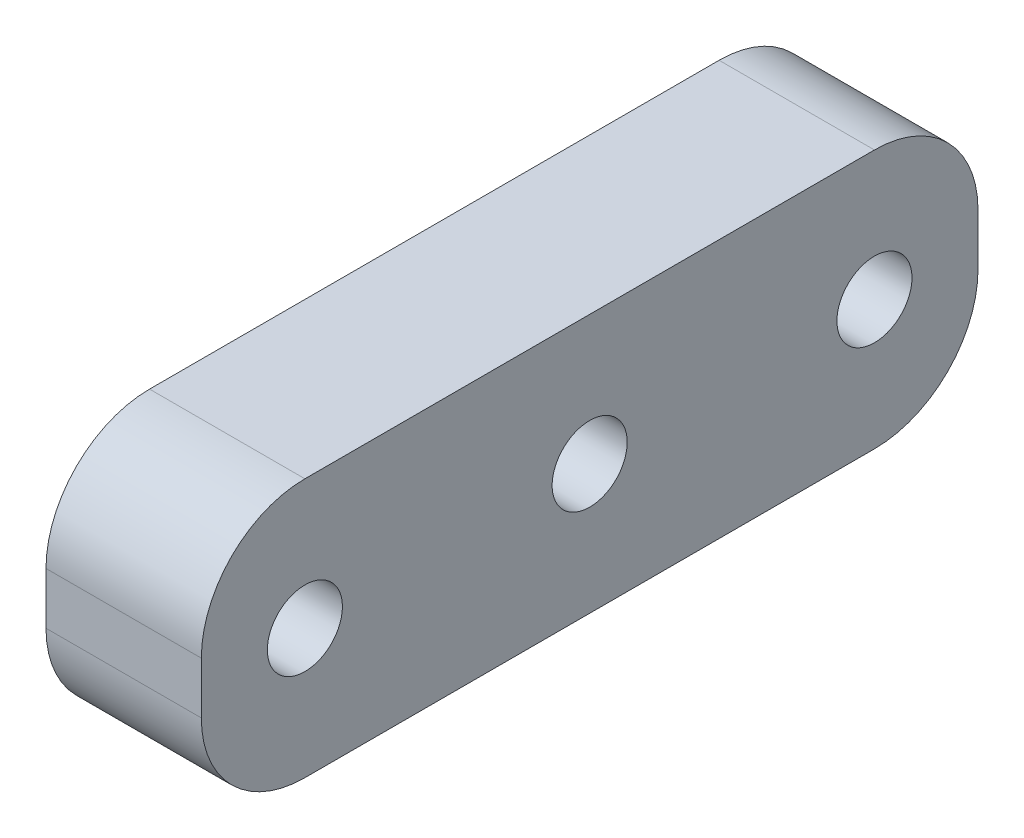
ISO-10303-21;
HEADER;
FILE_DESCRIPTION(('STEP AP214'),'2;1');
FILE_NAME('part.step','',(''),(''),'','','');
FILE_SCHEMA(('AUTOMOTIVE_DESIGN { 1 0 10303 214 1 1 1 1 }'));
ENDSEC;
DATA;
#1=APPLICATION_CONTEXT('core data for automotive mechanical design processes');
#2=APPLICATION_PROTOCOL_DEFINITION('international standard','automotive_design',2000,#1);
#3=PRODUCT_CONTEXT('',#1,'mechanical');
#4=PRODUCT('Part','Part','',(#3));
#5=PRODUCT_RELATED_PRODUCT_CATEGORY('part','',(#4));
#6=PRODUCT_DEFINITION_FORMATION('','',#4);
#7=PRODUCT_DEFINITION_CONTEXT('part definition',#1,'design');
#8=PRODUCT_DEFINITION('design','',#6,#7);
#9=PRODUCT_DEFINITION_SHAPE('','',#8);
#10=(LENGTH_UNIT() NAMED_UNIT(*) SI_UNIT(.MILLI.,.METRE.));
#11=(NAMED_UNIT(*) PLANE_ANGLE_UNIT() SI_UNIT($,.RADIAN.));
#12=(NAMED_UNIT(*) SI_UNIT($,.STERADIAN.) SOLID_ANGLE_UNIT());
#13=UNCERTAINTY_MEASURE_WITH_UNIT(LENGTH_MEASURE(1.E-05),#10,'distance_accuracy_value','');
#14=(GEOMETRIC_REPRESENTATION_CONTEXT(3) GLOBAL_UNCERTAINTY_ASSIGNED_CONTEXT((#13)) GLOBAL_UNIT_ASSIGNED_CONTEXT((#10,
#11,#12)) REPRESENTATION_CONTEXT('',''));
#15=CARTESIAN_POINT('',(0.,0.,0.));
#16=DIRECTION('',(0.,0.,1.));
#17=DIRECTION('',(1.,0.,0.));
#18=AXIS2_PLACEMENT_3D('',#15,#16,#17);
#19=CARTESIAN_POINT('',(6.,0.,0.));
#20=DIRECTION('',(0.,0.,-1.));
#21=DIRECTION('',(-1.,0.,0.));
#22=AXIS2_PLACEMENT_3D('',#19,#20,#21);
#23=PLANE('',#22);
#24=DIRECTION('',(0.,-1.,0.));
#25=VECTOR('',#24,1.);
#26=CARTESIAN_POINT('',(6.,0.,0.));
#27=LINE('',#26,#25);
#28=CARTESIAN_POINT('',(6.,-4.,0.));
#29=VERTEX_POINT('',#28);
#30=CARTESIAN_POINT('',(6.,-6.,0.));
#31=VERTEX_POINT('',#30);
#32=EDGE_CURVE('E128',#29,#31,#27,.T.);
#33=ORIENTED_EDGE('',*,*,#32,.F.);
#34=DIRECTION('',(-1.,0.,0.));
#35=VECTOR('',#34,1.);
#36=CARTESIAN_POINT('',(6.,-4.,0.));
#37=LINE('',#36,#35);
#38=CARTESIAN_POINT('',(0.,-4.,0.));
#39=VERTEX_POINT('',#38);
#40=EDGE_CURVE('E11',#29,#39,#37,.T.);
#41=ORIENTED_EDGE('',*,*,#40,.T.);
#42=DIRECTION('',(0.,-1.,0.));
#43=VECTOR('',#42,1.);
#44=CARTESIAN_POINT('',(0.,0.,0.));
#45=LINE('',#44,#43);
#46=CARTESIAN_POINT('',(0.,-6.,0.));
#47=VERTEX_POINT('',#46);
#48=EDGE_CURVE('E130',#39,#47,#45,.T.);
#49=ORIENTED_EDGE('',*,*,#48,.T.);
#50=DIRECTION('',(-1.,0.,0.));
#51=VECTOR('',#50,1.);
#52=CARTESIAN_POINT('',(6.,-6.,0.));
#53=LINE('',#52,#51);
#54=EDGE_CURVE('E41',#47,#31,#53,.F.);
#55=ORIENTED_EDGE('',*,*,#54,.T.);
#56=EDGE_LOOP('',(#33,#41,#49,#55));
#57=FACE_BOUND('',#56,.T.);
#58=ADVANCED_FACE('F33',(#57),#23,.F.);
#59=CARTESIAN_POINT('',(6.,-10.,0.));
#60=DIRECTION('',(0.,1.,0.));
#61=DIRECTION('',(0.,0.,1.));
#62=AXIS2_PLACEMENT_3D('',#59,#60,#61);
#63=PLANE('',#62);
#64=DIRECTION('',(0.,0.,-1.));
#65=VECTOR('',#64,1.);
#66=CARTESIAN_POINT('',(0.,-10.,0.));
#67=LINE('',#66,#65);
#68=CARTESIAN_POINT('',(0.,-10.,-4.));
#69=VERTEX_POINT('',#68);
#70=CARTESIAN_POINT('',(0.,-10.,-26.));
#71=VERTEX_POINT('',#70);
#72=EDGE_CURVE('E126',#69,#71,#67,.T.);
#73=ORIENTED_EDGE('',*,*,#72,.T.);
#74=DIRECTION('',(-1.,0.,0.));
#75=VECTOR('',#74,1.);
#76=CARTESIAN_POINT('',(6.,-10.,-26.));
#77=LINE('',#76,#75);
#78=CARTESIAN_POINT('',(6.,-10.,-26.));
#79=VERTEX_POINT('',#78);
#80=EDGE_CURVE('E105',#71,#79,#77,.F.);
#81=ORIENTED_EDGE('',*,*,#80,.T.);
#82=DIRECTION('',(0.,0.,-1.));
#83=VECTOR('',#82,1.);
#84=CARTESIAN_POINT('',(6.,-10.,0.));
#85=LINE('',#84,#83);
#86=CARTESIAN_POINT('',(6.,-10.,-4.));
#87=VERTEX_POINT('',#86);
#88=EDGE_CURVE('E166',#87,#79,#85,.T.);
#89=ORIENTED_EDGE('',*,*,#88,.F.);
#90=DIRECTION('',(-1.,0.,0.));
#91=VECTOR('',#90,1.);
#92=CARTESIAN_POINT('',(6.,-10.,-4.));
#93=LINE('',#92,#91);
#94=EDGE_CURVE('E110',#87,#69,#93,.T.);
#95=ORIENTED_EDGE('',*,*,#94,.T.);
#96=EDGE_LOOP('',(#73,#81,#89,#95));
#97=FACE_BOUND('',#96,.T.);
#98=ADVANCED_FACE('F170',(#97),#63,.F.);
#99=CARTESIAN_POINT('',(6.,0.,-30.));
#100=DIRECTION('',(0.,0.,1.));
#101=DIRECTION('',(1.,0.,0.));
#102=AXIS2_PLACEMENT_3D('',#99,#100,#101);
#103=PLANE('',#102);
#104=DIRECTION('',(0.,1.,0.));
#105=VECTOR('',#104,1.);
#106=CARTESIAN_POINT('',(6.,0.,-30.));
#107=LINE('',#106,#105);
#108=CARTESIAN_POINT('',(6.,-6.,-30.));
#109=VERTEX_POINT('',#108);
#110=CARTESIAN_POINT('',(6.,-4.,-30.));
#111=VERTEX_POINT('',#110);
#112=EDGE_CURVE('E119',#109,#111,#107,.T.);
#113=ORIENTED_EDGE('',*,*,#112,.F.);
#114=DIRECTION('',(-1.,0.,0.));
#115=VECTOR('',#114,1.);
#116=CARTESIAN_POINT('',(6.,-6.,-30.));
#117=LINE('',#116,#115);
#118=CARTESIAN_POINT('',(0.,-6.,-30.));
#119=VERTEX_POINT('',#118);
#120=EDGE_CURVE('E104',#109,#119,#117,.T.);
#121=ORIENTED_EDGE('',*,*,#120,.T.);
#122=DIRECTION('',(0.,1.,0.));
#123=VECTOR('',#122,1.);
#124=CARTESIAN_POINT('',(0.,0.,-30.));
#125=LINE('',#124,#123);
#126=CARTESIAN_POINT('',(0.,-4.,-30.));
#127=VERTEX_POINT('',#126);
#128=EDGE_CURVE('E117',#119,#127,#125,.T.);
#129=ORIENTED_EDGE('',*,*,#128,.T.);
#130=DIRECTION('',(-1.,0.,0.));
#131=VECTOR('',#130,1.);
#132=CARTESIAN_POINT('',(6.,-4.,-30.));
#133=LINE('',#132,#131);
#134=EDGE_CURVE('E121',#127,#111,#133,.F.);
#135=ORIENTED_EDGE('',*,*,#134,.T.);
#136=EDGE_LOOP('',(#113,#121,#129,#135));
#137=FACE_BOUND('',#136,.T.);
#138=ADVANCED_FACE('F116',(#137),#103,.F.);
#139=CARTESIAN_POINT('',(6.,0.,0.));
#140=DIRECTION('',(0.,-1.,0.));
#141=DIRECTION('',(0.,0.,-1.));
#142=AXIS2_PLACEMENT_3D('',#139,#140,#141);
#143=PLANE('',#142);
#144=DIRECTION('',(0.,0.,1.));
#145=VECTOR('',#144,1.);
#146=CARTESIAN_POINT('',(6.,0.,0.));
#147=LINE('',#146,#145);
#148=CARTESIAN_POINT('',(6.,0.,-26.));
#149=VERTEX_POINT('',#148);
#150=CARTESIAN_POINT('',(6.,0.,-4.));
#151=VERTEX_POINT('',#150);
#152=EDGE_CURVE('E134',#149,#151,#147,.T.);
#153=ORIENTED_EDGE('',*,*,#152,.F.);
#154=DIRECTION('',(-1.,0.,0.));
#155=VECTOR('',#154,1.);
#156=CARTESIAN_POINT('',(6.,0.,-26.));
#157=LINE('',#156,#155);
#158=CARTESIAN_POINT('',(0.,0.,-26.));
#159=VERTEX_POINT('',#158);
#160=EDGE_CURVE('E151',#149,#159,#157,.T.);
#161=ORIENTED_EDGE('',*,*,#160,.T.);
#162=DIRECTION('',(0.,0.,1.));
#163=VECTOR('',#162,1.);
#164=CARTESIAN_POINT('',(0.,0.,0.));
#165=LINE('',#164,#163);
#166=CARTESIAN_POINT('',(0.,0.,-4.));
#167=VERTEX_POINT('',#166);
#168=EDGE_CURVE('E125',#159,#167,#165,.T.);
#169=ORIENTED_EDGE('',*,*,#168,.T.);
#170=DIRECTION('',(-1.,0.,0.));
#171=VECTOR('',#170,1.);
#172=CARTESIAN_POINT('',(6.,0.,-4.));
#173=LINE('',#172,#171);
#174=EDGE_CURVE('E48',#167,#151,#173,.F.);
#175=ORIENTED_EDGE('',*,*,#174,.T.);
#176=EDGE_LOOP('',(#153,#161,#169,#175));
#177=FACE_BOUND('',#176,.T.);
#178=ADVANCED_FACE('F205',(#177),#143,.F.);
#179=CARTESIAN_POINT('',(6.,0.,0.));
#180=DIRECTION('',(1.,0.,0.));
#181=DIRECTION('',(0.,0.,-1.));
#182=AXIS2_PLACEMENT_3D('',#179,#180,#181);
#183=PLANE('',#182);
#184=CARTESIAN_POINT('',(6.,-5.,-15.));
#185=DIRECTION('',(1.,0.,0.));
#186=DIRECTION('',(0.,0.,-1.));
#187=AXIS2_PLACEMENT_3D('',#184,#185,#186);
#188=CIRCLE('',#187,1.45);
#189=CARTESIAN_POINT('',(6.,-5.,-16.45));
#190=VERTEX_POINT('',#189);
#191=EDGE_CURVE('E188',#190,#190,#188,.T.);
#192=ORIENTED_EDGE('',*,*,#191,.F.);
#193=EDGE_LOOP('',(#192));
#194=FACE_BOUND('',#193,.T.);
#195=CARTESIAN_POINT('',(6.,-5.,-26.));
#196=DIRECTION('',(1.,0.,0.));
#197=DIRECTION('',(0.,0.,-1.));
#198=AXIS2_PLACEMENT_3D('',#195,#196,#197);
#199=CIRCLE('',#198,1.45);
#200=CARTESIAN_POINT('',(6.,-5.,-27.45));
#201=VERTEX_POINT('',#200);
#202=EDGE_CURVE('E182',#201,#201,#199,.T.);
#203=ORIENTED_EDGE('',*,*,#202,.F.);
#204=EDGE_LOOP('',(#203));
#205=FACE_BOUND('',#204,.T.);
#206=CARTESIAN_POINT('',(6.,-5.,-4.));
#207=DIRECTION('',(1.,0.,0.));
#208=DIRECTION('',(0.,0.,-1.));
#209=AXIS2_PLACEMENT_3D('',#206,#207,#208);
#210=CIRCLE('',#209,1.45);
#211=CARTESIAN_POINT('',(6.,-5.,-5.45));
#212=VERTEX_POINT('',#211);
#213=EDGE_CURVE('E173',#212,#212,#210,.T.);
#214=ORIENTED_EDGE('',*,*,#213,.F.);
#215=EDGE_LOOP('',(#214));
#216=FACE_BOUND('',#215,.T.);
#217=ORIENTED_EDGE('',*,*,#88,.T.);
#218=CARTESIAN_POINT('',(6.,-6.,-26.));
#219=DIRECTION('',(1.,0.,0.));
#220=DIRECTION('',(0.,0.,-1.));
#221=AXIS2_PLACEMENT_3D('',#218,#219,#220);
#222=CIRCLE('',#221,4.);
#223=EDGE_CURVE('E148',#79,#109,#222,.T.);
#224=ORIENTED_EDGE('',*,*,#223,.T.);
#225=ORIENTED_EDGE('',*,*,#112,.T.);
#226=CARTESIAN_POINT('',(6.,-4.,-26.));
#227=DIRECTION('',(1.,0.,0.));
#228=DIRECTION('',(0.,0.,-1.));
#229=AXIS2_PLACEMENT_3D('',#226,#227,#228);
#230=CIRCLE('',#229,4.);
#231=EDGE_CURVE('E55',#111,#149,#230,.T.);
#232=ORIENTED_EDGE('',*,*,#231,.T.);
#233=ORIENTED_EDGE('',*,*,#152,.T.);
#234=CARTESIAN_POINT('',(6.,-4.,-4.));
#235=DIRECTION('',(1.,0.,0.));
#236=DIRECTION('',(0.,0.,-1.));
#237=AXIS2_PLACEMENT_3D('',#234,#235,#236);
#238=CIRCLE('',#237,4.);
#239=EDGE_CURVE('E145',#151,#29,#238,.T.);
#240=ORIENTED_EDGE('',*,*,#239,.T.);
#241=ORIENTED_EDGE('',*,*,#32,.T.);
#242=CARTESIAN_POINT('',(6.,-6.,-4.));
#243=DIRECTION('',(1.,0.,0.));
#244=DIRECTION('',(0.,0.,-1.));
#245=AXIS2_PLACEMENT_3D('',#242,#243,#244);
#246=CIRCLE('',#245,4.);
#247=EDGE_CURVE('E143',#31,#87,#246,.T.);
#248=ORIENTED_EDGE('',*,*,#247,.T.);
#249=EDGE_LOOP('',(#217,#224,#225,#232,#233,#240,#241,#248));
#250=FACE_BOUND('',#249,.T.);
#251=ADVANCED_FACE('F163',(#194,#205,#216,#250),#183,.T.);
#252=CARTESIAN_POINT('',(0.,0.,0.));
#253=DIRECTION('',(1.,0.,0.));
#254=DIRECTION('',(0.,0.,-1.));
#255=AXIS2_PLACEMENT_3D('',#252,#253,#254);
#256=PLANE('',#255);
#257=CARTESIAN_POINT('',(0.,-5.,-15.));
#258=DIRECTION('',(1.,0.,0.));
#259=DIRECTION('',(0.,0.,-1.));
#260=AXIS2_PLACEMENT_3D('',#257,#258,#259);
#261=CIRCLE('',#260,1.45);
#262=CARTESIAN_POINT('',(0.,-5.,-16.45));
#263=VERTEX_POINT('',#262);
#264=EDGE_CURVE('E180',#263,#263,#261,.T.);
#265=ORIENTED_EDGE('',*,*,#264,.T.);
#266=EDGE_LOOP('',(#265));
#267=FACE_BOUND('',#266,.T.);
#268=CARTESIAN_POINT('',(0.,-5.,-26.));
#269=DIRECTION('',(1.,0.,0.));
#270=DIRECTION('',(0.,0.,-1.));
#271=AXIS2_PLACEMENT_3D('',#268,#269,#270);
#272=CIRCLE('',#271,1.45);
#273=CARTESIAN_POINT('',(0.,-5.,-27.45));
#274=VERTEX_POINT('',#273);
#275=EDGE_CURVE('E185',#274,#274,#272,.T.);
#276=ORIENTED_EDGE('',*,*,#275,.T.);
#277=EDGE_LOOP('',(#276));
#278=FACE_BOUND('',#277,.T.);
#279=CARTESIAN_POINT('',(0.,-5.,-4.));
#280=DIRECTION('',(1.,0.,0.));
#281=DIRECTION('',(0.,0.,-1.));
#282=AXIS2_PLACEMENT_3D('',#279,#280,#281);
#283=CIRCLE('',#282,1.45);
#284=CARTESIAN_POINT('',(0.,-5.,-5.45));
#285=VERTEX_POINT('',#284);
#286=EDGE_CURVE('E171',#285,#285,#283,.T.);
#287=ORIENTED_EDGE('',*,*,#286,.T.);
#288=EDGE_LOOP('',(#287));
#289=FACE_BOUND('',#288,.T.);
#290=ORIENTED_EDGE('',*,*,#128,.F.);
#291=CARTESIAN_POINT('',(0.,-6.,-26.));
#292=DIRECTION('',(1.,0.,0.));
#293=DIRECTION('',(0.,0.,-1.));
#294=AXIS2_PLACEMENT_3D('',#291,#292,#293);
#295=CIRCLE('',#294,4.);
#296=EDGE_CURVE('E100',#119,#71,#295,.F.);
#297=ORIENTED_EDGE('',*,*,#296,.T.);
#298=ORIENTED_EDGE('',*,*,#72,.F.);
#299=CARTESIAN_POINT('',(0.,-6.,-4.));
#300=DIRECTION('',(1.,0.,0.));
#301=DIRECTION('',(0.,0.,-1.));
#302=AXIS2_PLACEMENT_3D('',#299,#300,#301);
#303=CIRCLE('',#302,4.);
#304=EDGE_CURVE('E120',#69,#47,#303,.F.);
#305=ORIENTED_EDGE('',*,*,#304,.T.);
#306=ORIENTED_EDGE('',*,*,#48,.F.);
#307=CARTESIAN_POINT('',(0.,-4.,-4.));
#308=DIRECTION('',(1.,0.,0.));
#309=DIRECTION('',(0.,0.,-1.));
#310=AXIS2_PLACEMENT_3D('',#307,#308,#309);
#311=CIRCLE('',#310,4.);
#312=EDGE_CURVE('E137',#39,#167,#311,.F.);
#313=ORIENTED_EDGE('',*,*,#312,.T.);
#314=ORIENTED_EDGE('',*,*,#168,.F.);
#315=CARTESIAN_POINT('',(0.,-4.,-26.));
#316=DIRECTION('',(1.,0.,0.));
#317=DIRECTION('',(0.,0.,-1.));
#318=AXIS2_PLACEMENT_3D('',#315,#316,#317);
#319=CIRCLE('',#318,4.);
#320=EDGE_CURVE('E111',#159,#127,#319,.F.);
#321=ORIENTED_EDGE('',*,*,#320,.T.);
#322=EDGE_LOOP('',(#290,#297,#298,#305,#306,#313,#314,#321));
#323=FACE_BOUND('',#322,.T.);
#324=ADVANCED_FACE('F123',(#267,#278,#289,#323),#256,.F.);
#325=CARTESIAN_POINT('',(0.,-5.,-4.));
#326=DIRECTION('',(1.,0.,0.));
#327=DIRECTION('',(0.,0.,-1.));
#328=AXIS2_PLACEMENT_3D('',#325,#326,#327);
#329=CYLINDRICAL_SURFACE('',#328,1.45);
#330=ORIENTED_EDGE('',*,*,#286,.F.);
#331=EDGE_LOOP('',(#330));
#332=FACE_BOUND('',#331,.T.);
#333=ORIENTED_EDGE('',*,*,#213,.T.);
#334=EDGE_LOOP('',(#333));
#335=FACE_BOUND('',#334,.T.);
#336=ADVANCED_FACE('F211',(#332,#335),#329,.F.);
#337=CARTESIAN_POINT('',(0.,-5.,-26.));
#338=DIRECTION('',(1.,0.,0.));
#339=DIRECTION('',(0.,0.,-1.));
#340=AXIS2_PLACEMENT_3D('',#337,#338,#339);
#341=CYLINDRICAL_SURFACE('',#340,1.45);
#342=ORIENTED_EDGE('',*,*,#275,.F.);
#343=EDGE_LOOP('',(#342));
#344=FACE_BOUND('',#343,.T.);
#345=ORIENTED_EDGE('',*,*,#202,.T.);
#346=EDGE_LOOP('',(#345));
#347=FACE_BOUND('',#346,.T.);
#348=ADVANCED_FACE('F199',(#344,#347),#341,.F.);
#349=CARTESIAN_POINT('',(0.,-5.,-15.));
#350=DIRECTION('',(1.,0.,0.));
#351=DIRECTION('',(0.,0.,-1.));
#352=AXIS2_PLACEMENT_3D('',#349,#350,#351);
#353=CYLINDRICAL_SURFACE('',#352,1.45);
#354=ORIENTED_EDGE('',*,*,#264,.F.);
#355=EDGE_LOOP('',(#354));
#356=FACE_BOUND('',#355,.T.);
#357=ORIENTED_EDGE('',*,*,#191,.T.);
#358=EDGE_LOOP('',(#357));
#359=FACE_BOUND('',#358,.T.);
#360=ADVANCED_FACE('F196',(#356,#359),#353,.F.);
#361=CARTESIAN_POINT('',(6.,-6.,-26.));
#362=DIRECTION('',(-1.,0.,0.));
#363=DIRECTION('',(0.,0.,1.));
#364=AXIS2_PLACEMENT_3D('',#361,#362,#363);
#365=CYLINDRICAL_SURFACE('',#364,4.);
#366=ORIENTED_EDGE('',*,*,#223,.F.);
#367=ORIENTED_EDGE('',*,*,#80,.F.);
#368=ORIENTED_EDGE('',*,*,#296,.F.);
#369=ORIENTED_EDGE('',*,*,#120,.F.);
#370=EDGE_LOOP('',(#366,#367,#368,#369));
#371=FACE_BOUND('',#370,.T.);
#372=ADVANCED_FACE('F103',(#371),#365,.T.);
#373=CARTESIAN_POINT('',(6.,-4.,-26.));
#374=DIRECTION('',(-1.,0.,0.));
#375=DIRECTION('',(0.,0.,1.));
#376=AXIS2_PLACEMENT_3D('',#373,#374,#375);
#377=CYLINDRICAL_SURFACE('',#376,4.);
#378=ORIENTED_EDGE('',*,*,#231,.F.);
#379=ORIENTED_EDGE('',*,*,#134,.F.);
#380=ORIENTED_EDGE('',*,*,#320,.F.);
#381=ORIENTED_EDGE('',*,*,#160,.F.);
#382=EDGE_LOOP('',(#378,#379,#380,#381));
#383=FACE_BOUND('',#382,.T.);
#384=ADVANCED_FACE('F233',(#383),#377,.T.);
#385=CARTESIAN_POINT('',(6.,-4.,-4.));
#386=DIRECTION('',(-1.,0.,0.));
#387=DIRECTION('',(0.,0.,1.));
#388=AXIS2_PLACEMENT_3D('',#385,#386,#387);
#389=CYLINDRICAL_SURFACE('',#388,4.);
#390=ORIENTED_EDGE('',*,*,#239,.F.);
#391=ORIENTED_EDGE('',*,*,#174,.F.);
#392=ORIENTED_EDGE('',*,*,#312,.F.);
#393=ORIENTED_EDGE('',*,*,#40,.F.);
#394=EDGE_LOOP('',(#390,#391,#392,#393));
#395=FACE_BOUND('',#394,.T.);
#396=ADVANCED_FACE('F235',(#395),#389,.T.);
#397=CARTESIAN_POINT('',(6.,-6.,-4.));
#398=DIRECTION('',(-1.,0.,0.));
#399=DIRECTION('',(0.,0.,1.));
#400=AXIS2_PLACEMENT_3D('',#397,#398,#399);
#401=CYLINDRICAL_SURFACE('',#400,4.);
#402=ORIENTED_EDGE('',*,*,#247,.F.);
#403=ORIENTED_EDGE('',*,*,#54,.F.);
#404=ORIENTED_EDGE('',*,*,#304,.F.);
#405=ORIENTED_EDGE('',*,*,#94,.F.);
#406=EDGE_LOOP('',(#402,#403,#404,#405));
#407=FACE_BOUND('',#406,.T.);
#408=ADVANCED_FACE('F35',(#407),#401,.T.);
#409=CLOSED_SHELL('',(#58,#98,#138,#178,#251,#324,#336,#348,#360,#372,#384,#396,#408));
#410=MANIFOLD_SOLID_BREP('B2',#409);
#411=ADVANCED_BREP_SHAPE_REPRESENTATION('',(#18,#410),#14);
#412=SHAPE_DEFINITION_REPRESENTATION(#9,#411);
ENDSEC;
END-ISO-10303-21;
